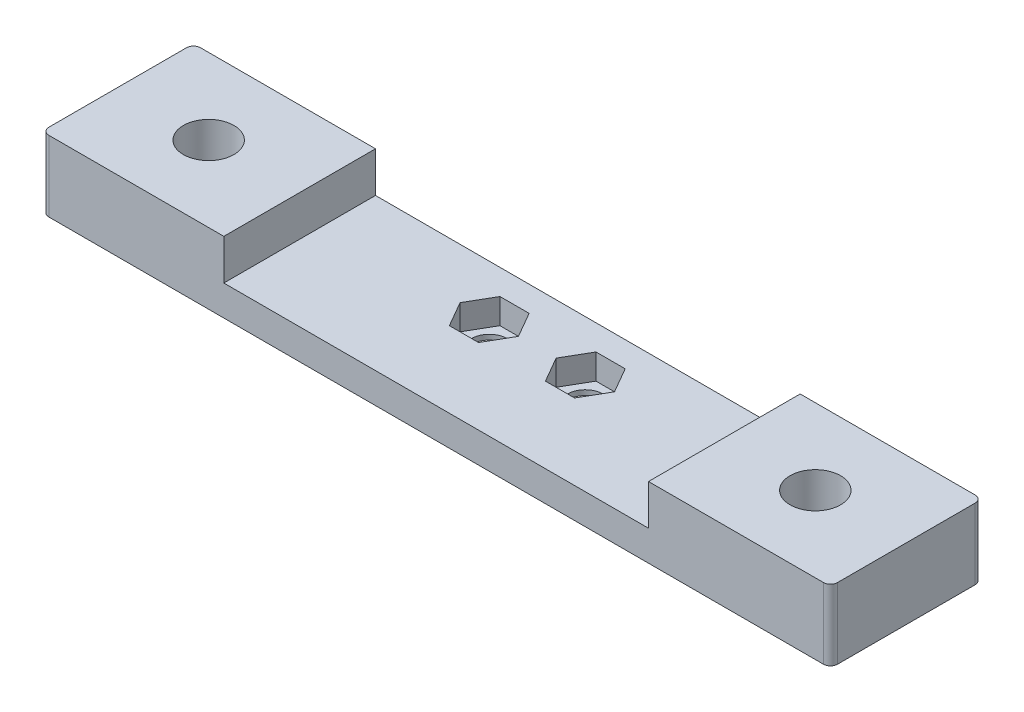
ISO-10303-21;
HEADER;
FILE_DESCRIPTION(('STEP AP214'),'2;1');
FILE_NAME('part.step','',(''),(''),'','','');
FILE_SCHEMA(('AUTOMOTIVE_DESIGN { 1 0 10303 214 1 1 1 1 }'));
ENDSEC;
DATA;
#1=APPLICATION_CONTEXT('core data for automotive mechanical design processes');
#2=APPLICATION_PROTOCOL_DEFINITION('international standard','automotive_design',2000,#1);
#3=PRODUCT_CONTEXT('',#1,'mechanical');
#4=PRODUCT('Part','Part','',(#3));
#5=PRODUCT_RELATED_PRODUCT_CATEGORY('part','',(#4));
#6=PRODUCT_DEFINITION_FORMATION('','',#4);
#7=PRODUCT_DEFINITION_CONTEXT('part definition',#1,'design');
#8=PRODUCT_DEFINITION('design','',#6,#7);
#9=PRODUCT_DEFINITION_SHAPE('','',#8);
#10=(LENGTH_UNIT() NAMED_UNIT(*) SI_UNIT(.MILLI.,.METRE.));
#11=(NAMED_UNIT(*) PLANE_ANGLE_UNIT() SI_UNIT($,.RADIAN.));
#12=(NAMED_UNIT(*) SI_UNIT($,.STERADIAN.) SOLID_ANGLE_UNIT());
#13=UNCERTAINTY_MEASURE_WITH_UNIT(LENGTH_MEASURE(1.E-05),#10,'distance_accuracy_value','');
#14=(GEOMETRIC_REPRESENTATION_CONTEXT(3) GLOBAL_UNCERTAINTY_ASSIGNED_CONTEXT((#13)) GLOBAL_UNIT_ASSIGNED_CONTEXT((#10,
#11,#12)) REPRESENTATION_CONTEXT('',''));
#15=CARTESIAN_POINT('',(0.,0.,0.));
#16=DIRECTION('',(0.,0.,1.));
#17=DIRECTION('',(1.,0.,0.));
#18=AXIS2_PLACEMENT_3D('',#15,#16,#17);
#19=CARTESIAN_POINT('',(0.,3.,0.));
#20=DIRECTION('',(0.,1.,0.));
#21=DIRECTION('',(0.,0.,1.));
#22=AXIS2_PLACEMENT_3D('',#19,#20,#21);
#23=PLANE('',#22);
#24=DIRECTION('',(-1.,0.,0.));
#25=VECTOR('',#24,1.);
#26=CARTESIAN_POINT('',(0.,3.,-12.5));
#27=LINE('',#26,#25);
#28=CARTESIAN_POINT('',(35.6933756729741,3.,-12.5));
#29=VERTEX_POINT('',#28);
#30=CARTESIAN_POINT('',(32.8066243270259,3.,-12.5));
#31=VERTEX_POINT('',#30);
#32=EDGE_CURVE('E381',#29,#31,#27,.T.);
#33=ORIENTED_EDGE('',*,*,#32,.F.);
#34=DIRECTION('',(-0.499999999999993,0.,-0.866025403784443));
#35=VECTOR('',#34,1.);
#36=CARTESIAN_POINT('',(32.1826905283835,3.,-18.5806850398083));
#37=LINE('',#36,#35);
#38=CARTESIAN_POINT('',(37.1367513459481,3.,-9.99999999999999));
#39=VERTEX_POINT('',#38);
#40=EDGE_CURVE('E385',#39,#29,#37,.T.);
#41=ORIENTED_EDGE('',*,*,#40,.F.);
#42=DIRECTION('',(0.499999999999999,0.,-0.866025403784439));
#43=VECTOR('',#42,1.);
#44=CARTESIAN_POINT('',(23.5224364905389,3.,13.5806850398085));
#45=LINE('',#44,#43);
#46=CARTESIAN_POINT('',(35.6933756729741,3.,-7.49999999999999));
#47=VERTEX_POINT('',#46);
#48=EDGE_CURVE('E389',#47,#39,#45,.T.);
#49=ORIENTED_EDGE('',*,*,#48,.F.);
#50=DIRECTION('',(1.,0.,0.));
#51=VECTOR('',#50,1.);
#52=CARTESIAN_POINT('',(0.,3.,-7.49999999999999));
#53=LINE('',#52,#51);
#54=CARTESIAN_POINT('',(32.8066243270259,3.,-7.49999999999999));
#55=VERTEX_POINT('',#54);
#56=EDGE_CURVE('E393',#55,#47,#53,.T.);
#57=ORIENTED_EDGE('',*,*,#56,.F.);
#58=DIRECTION('',(0.5,0.,0.866025403784439));
#59=VECTOR('',#58,1.);
#60=CARTESIAN_POINT('',(27.8525635094611,3.,-16.0806850398085));
#61=LINE('',#60,#59);
#62=CARTESIAN_POINT('',(31.3632486540519,3.,-10.));
#63=VERTEX_POINT('',#62);
#64=EDGE_CURVE('E397',#63,#55,#61,.T.);
#65=ORIENTED_EDGE('',*,*,#64,.F.);
#66=DIRECTION('',(-0.500000000000001,0.,0.866025403784438));
#67=VECTOR('',#66,1.);
#68=CARTESIAN_POINT('',(19.1923094716167,3.,11.0806850398085));
#69=LINE('',#68,#67);
#70=EDGE_CURVE('E401',#31,#63,#69,.T.);
#71=ORIENTED_EDGE('',*,*,#70,.F.);
#72=EDGE_LOOP('',(#33,#41,#49,#57,#65,#71));
#73=FACE_BOUND('',#72,.T.);
#74=DIRECTION('',(-0.500000000000005,0.,-0.866025403784436));
#75=VECTOR('',#74,1.);
#76=CARTESIAN_POINT('',(39.3076905283831,3.,-22.6943057077848));
#77=LINE('',#76,#75);
#78=CARTESIAN_POINT('',(46.6367513459481,3.,-10.));
#79=VERTEX_POINT('',#78);
#80=CARTESIAN_POINT('',(45.193375672974,3.,-12.5));
#81=VERTEX_POINT('',#80);
#82=EDGE_CURVE('E356',#79,#81,#77,.T.);
#83=ORIENTED_EDGE('',*,*,#82,.F.);
#84=DIRECTION('',(0.500000000000001,0.,-0.866025403784438));
#85=VECTOR('',#84,1.);
#86=CARTESIAN_POINT('',(30.6474364905389,3.,17.6943057077846));
#87=LINE('',#86,#85);
#88=CARTESIAN_POINT('',(45.193375672974,3.,-7.49999999999995));
#89=VERTEX_POINT('',#88);
#90=EDGE_CURVE('E360',#89,#79,#87,.T.);
#91=ORIENTED_EDGE('',*,*,#90,.F.);
#92=DIRECTION('',(1.,0.,0.));
#93=VECTOR('',#92,1.);
#94=CARTESIAN_POINT('',(0.,3.,-7.49999999999996));
#95=LINE('',#94,#93);
#96=CARTESIAN_POINT('',(42.306624327026,3.,-7.49999999999995));
#97=VERTEX_POINT('',#96);
#98=EDGE_CURVE('E365',#97,#89,#95,.T.);
#99=ORIENTED_EDGE('',*,*,#98,.F.);
#100=DIRECTION('',(0.499999999999999,0.,0.86602540378444));
#101=VECTOR('',#100,1.);
#102=CARTESIAN_POINT('',(34.9775635094612,3.,-20.1943057077845));
#103=LINE('',#102,#101);
#104=CARTESIAN_POINT('',(40.8632486540519,3.,-10.));
#105=VERTEX_POINT('',#104);
#106=EDGE_CURVE('E369',#105,#97,#103,.T.);
#107=ORIENTED_EDGE('',*,*,#106,.F.);
#108=DIRECTION('',(-0.499999999999999,0.,0.866025403784439));
#109=VECTOR('',#108,1.);
#110=CARTESIAN_POINT('',(26.3173094716167,3.,15.1943057077846));
#111=LINE('',#110,#109);
#112=CARTESIAN_POINT('',(42.3066243270259,3.,-12.5));
#113=VERTEX_POINT('',#112);
#114=EDGE_CURVE('E373',#113,#105,#111,.T.);
#115=ORIENTED_EDGE('',*,*,#114,.F.);
#116=DIRECTION('',(-1.,0.,0.));
#117=VECTOR('',#116,1.);
#118=CARTESIAN_POINT('',(0.,3.,-12.5));
#119=LINE('',#118,#117);
#120=EDGE_CURVE('E377',#81,#113,#119,.T.);
#121=ORIENTED_EDGE('',*,*,#120,.F.);
#122=EDGE_LOOP('',(#83,#91,#99,#107,#115,#121));
#123=FACE_BOUND('',#122,.T.);
#124=DIRECTION('',(1.,0.,0.));
#125=VECTOR('',#124,1.);
#126=CARTESIAN_POINT('',(0.,3.,-15.));
#127=LINE('',#126,#125);
#128=CARTESIAN_POINT('',(18.,3.,-15.));
#129=VERTEX_POINT('',#128);
#130=CARTESIAN_POINT('',(60.,3.,-15.));
#131=VERTEX_POINT('',#130);
#132=EDGE_CURVE('E57',#129,#131,#127,.T.);
#133=ORIENTED_EDGE('',*,*,#132,.F.);
#134=DIRECTION('',(0.,0.,1.));
#135=VECTOR('',#134,1.);
#136=CARTESIAN_POINT('',(18.,3.,0.));
#137=LINE('',#136,#135);
#138=CARTESIAN_POINT('',(18.,3.,0.));
#139=VERTEX_POINT('',#138);
#140=EDGE_CURVE('E248',#129,#139,#137,.T.);
#141=ORIENTED_EDGE('',*,*,#140,.T.);
#142=DIRECTION('',(1.,0.,0.));
#143=VECTOR('',#142,1.);
#144=CARTESIAN_POINT('',(0.,3.,0.));
#145=LINE('',#144,#143);
#146=CARTESIAN_POINT('',(60.,3.,0.));
#147=VERTEX_POINT('',#146);
#148=EDGE_CURVE('E208',#139,#147,#145,.T.);
#149=ORIENTED_EDGE('',*,*,#148,.T.);
#150=DIRECTION('',(0.,0.,1.));
#151=VECTOR('',#150,1.);
#152=CARTESIAN_POINT('',(60.,3.,0.));
#153=LINE('',#152,#151);
#154=EDGE_CURVE('E285',#131,#147,#153,.T.);
#155=ORIENTED_EDGE('',*,*,#154,.F.);
#156=EDGE_LOOP('',(#133,#141,#149,#155));
#157=FACE_BOUND('',#156,.T.);
#158=ADVANCED_FACE('F41',(#73,#123,#157),#23,.T.);
#159=CARTESIAN_POINT('',(0.,3.,0.));
#160=DIRECTION('',(0.,0.,-1.));
#161=DIRECTION('',(-1.,0.,0.));
#162=AXIS2_PLACEMENT_3D('',#159,#160,#161);
#163=PLANE('',#162);
#164=DIRECTION('',(1.,0.,0.));
#165=VECTOR('',#164,1.);
#166=CARTESIAN_POINT('',(0.,0.,0.));
#167=LINE('',#166,#165);
#168=CARTESIAN_POINT('',(0.7,0.,0.));
#169=VERTEX_POINT('',#168);
#170=CARTESIAN_POINT('',(77.3,0.,0.));
#171=VERTEX_POINT('',#170);
#172=EDGE_CURVE('E417',#169,#171,#167,.T.);
#173=ORIENTED_EDGE('',*,*,#172,.T.);
#174=DIRECTION('',(0.,-1.,0.));
#175=VECTOR('',#174,1.);
#176=CARTESIAN_POINT('',(77.3,3.,0.));
#177=LINE('',#176,#175);
#178=CARTESIAN_POINT('',(77.3,7.,0.));
#179=VERTEX_POINT('',#178);
#180=EDGE_CURVE('E505',#171,#179,#177,.F.);
#181=ORIENTED_EDGE('',*,*,#180,.T.);
#182=DIRECTION('',(-1.,0.,0.));
#183=VECTOR('',#182,1.);
#184=CARTESIAN_POINT('',(0.,7.,0.));
#185=LINE('',#184,#183);
#186=CARTESIAN_POINT('',(60.,7.,0.));
#187=VERTEX_POINT('',#186);
#188=EDGE_CURVE('E256',#179,#187,#185,.T.);
#189=ORIENTED_EDGE('',*,*,#188,.T.);
#190=DIRECTION('',(0.,-1.,0.));
#191=VECTOR('',#190,1.);
#192=CARTESIAN_POINT('',(60.,7.,0.));
#193=LINE('',#192,#191);
#194=EDGE_CURVE('E280',#187,#147,#193,.T.);
#195=ORIENTED_EDGE('',*,*,#194,.T.);
#196=ORIENTED_EDGE('',*,*,#148,.F.);
#197=DIRECTION('',(0.,-1.,0.));
#198=VECTOR('',#197,1.);
#199=CARTESIAN_POINT('',(18.,7.,0.));
#200=LINE('',#199,#198);
#201=CARTESIAN_POINT('',(18.,7.,0.));
#202=VERTEX_POINT('',#201);
#203=EDGE_CURVE('E201',#202,#139,#200,.T.);
#204=ORIENTED_EDGE('',*,*,#203,.F.);
#205=DIRECTION('',(-1.,0.,0.));
#206=VECTOR('',#205,1.);
#207=CARTESIAN_POINT('',(0.,7.,0.));
#208=LINE('',#207,#206);
#209=CARTESIAN_POINT('',(0.7,7.,0.));
#210=VERTEX_POINT('',#209);
#211=EDGE_CURVE('E206',#202,#210,#208,.T.);
#212=ORIENTED_EDGE('',*,*,#211,.T.);
#213=DIRECTION('',(0.,-1.,0.));
#214=VECTOR('',#213,1.);
#215=CARTESIAN_POINT('',(0.7,0.,0.));
#216=LINE('',#215,#214);
#217=EDGE_CURVE('E502',#210,#169,#216,.T.);
#218=ORIENTED_EDGE('',*,*,#217,.T.);
#219=EDGE_LOOP('',(#173,#181,#189,#195,#196,#204,#212,#218));
#220=FACE_BOUND('',#219,.T.);
#221=ADVANCED_FACE('F203',(#220),#163,.F.);
#222=CARTESIAN_POINT('',(78.,3.,0.));
#223=DIRECTION('',(-1.,0.,0.));
#224=DIRECTION('',(0.,0.,1.));
#225=AXIS2_PLACEMENT_3D('',#222,#223,#224);
#226=PLANE('',#225);
#227=DIRECTION('',(0.,0.,-1.));
#228=VECTOR('',#227,1.);
#229=CARTESIAN_POINT('',(78.,0.,0.));
#230=LINE('',#229,#228);
#231=CARTESIAN_POINT('',(78.,0.,-0.7));
#232=VERTEX_POINT('',#231);
#233=CARTESIAN_POINT('',(78.,0.,-14.3));
#234=VERTEX_POINT('',#233);
#235=EDGE_CURVE('E420',#232,#234,#230,.T.);
#236=ORIENTED_EDGE('',*,*,#235,.T.);
#237=DIRECTION('',(0.,-1.,0.));
#238=VECTOR('',#237,1.);
#239=CARTESIAN_POINT('',(78.,3.,-14.3));
#240=LINE('',#239,#238);
#241=CARTESIAN_POINT('',(78.,7.,-14.3));
#242=VERTEX_POINT('',#241);
#243=EDGE_CURVE('E499',#234,#242,#240,.F.);
#244=ORIENTED_EDGE('',*,*,#243,.T.);
#245=DIRECTION('',(0.,0.,1.));
#246=VECTOR('',#245,1.);
#247=CARTESIAN_POINT('',(78.,7.,0.));
#248=LINE('',#247,#246);
#249=CARTESIAN_POINT('',(78.,7.,-0.7));
#250=VERTEX_POINT('',#249);
#251=EDGE_CURVE('E272',#242,#250,#248,.T.);
#252=ORIENTED_EDGE('',*,*,#251,.T.);
#253=DIRECTION('',(0.,-1.,0.));
#254=VECTOR('',#253,1.);
#255=CARTESIAN_POINT('',(78.,3.,-0.7));
#256=LINE('',#255,#254);
#257=EDGE_CURVE('E495',#250,#232,#256,.T.);
#258=ORIENTED_EDGE('',*,*,#257,.T.);
#259=EDGE_LOOP('',(#236,#244,#252,#258));
#260=FACE_BOUND('',#259,.T.);
#261=ADVANCED_FACE('F552',(#260),#226,.F.);
#262=CARTESIAN_POINT('',(0.,3.,-15.));
#263=DIRECTION('',(0.,0.,-1.));
#264=DIRECTION('',(-1.,0.,0.));
#265=AXIS2_PLACEMENT_3D('',#262,#263,#264);
#266=PLANE('',#265);
#267=DIRECTION('',(0.,-1.,0.));
#268=VECTOR('',#267,1.);
#269=CARTESIAN_POINT('',(18.,7.,-15.));
#270=LINE('',#269,#268);
#271=CARTESIAN_POINT('',(18.,7.,-15.));
#272=VERTEX_POINT('',#271);
#273=EDGE_CURVE('E211',#272,#129,#270,.T.);
#274=ORIENTED_EDGE('',*,*,#273,.T.);
#275=ORIENTED_EDGE('',*,*,#132,.T.);
#276=DIRECTION('',(0.,-1.,0.));
#277=VECTOR('',#276,1.);
#278=CARTESIAN_POINT('',(60.,7.,-15.));
#279=LINE('',#278,#277);
#280=CARTESIAN_POINT('',(60.,7.,-15.));
#281=VERTEX_POINT('',#280);
#282=EDGE_CURVE('E281',#281,#131,#279,.T.);
#283=ORIENTED_EDGE('',*,*,#282,.F.);
#284=DIRECTION('',(1.,0.,0.));
#285=VECTOR('',#284,1.);
#286=CARTESIAN_POINT('',(0.,7.,-15.));
#287=LINE('',#286,#285);
#288=CARTESIAN_POINT('',(77.3,7.,-15.));
#289=VERTEX_POINT('',#288);
#290=EDGE_CURVE('E264',#281,#289,#287,.T.);
#291=ORIENTED_EDGE('',*,*,#290,.T.);
#292=DIRECTION('',(0.,-1.,0.));
#293=VECTOR('',#292,1.);
#294=CARTESIAN_POINT('',(77.3,0.,-15.));
#295=LINE('',#294,#293);
#296=CARTESIAN_POINT('',(77.3,0.,-15.));
#297=VERTEX_POINT('',#296);
#298=EDGE_CURVE('E478',#289,#297,#295,.T.);
#299=ORIENTED_EDGE('',*,*,#298,.T.);
#300=DIRECTION('',(1.,0.,0.));
#301=VECTOR('',#300,1.);
#302=CARTESIAN_POINT('',(0.,0.,-15.));
#303=LINE('',#302,#301);
#304=CARTESIAN_POINT('',(0.7,0.,-15.));
#305=VERTEX_POINT('',#304);
#306=EDGE_CURVE('E424',#305,#297,#303,.T.);
#307=ORIENTED_EDGE('',*,*,#306,.F.);
#308=DIRECTION('',(0.,-1.,0.));
#309=VECTOR('',#308,1.);
#310=CARTESIAN_POINT('',(0.7,3.,-15.));
#311=LINE('',#310,#309);
#312=CARTESIAN_POINT('',(0.7,7.,-15.));
#313=VERTEX_POINT('',#312);
#314=EDGE_CURVE('E454',#305,#313,#311,.F.);
#315=ORIENTED_EDGE('',*,*,#314,.T.);
#316=DIRECTION('',(1.,0.,0.));
#317=VECTOR('',#316,1.);
#318=CARTESIAN_POINT('',(0.,7.,-15.));
#319=LINE('',#318,#317);
#320=EDGE_CURVE('E241',#313,#272,#319,.T.);
#321=ORIENTED_EDGE('',*,*,#320,.T.);
#322=EDGE_LOOP('',(#274,#275,#283,#291,#299,#307,#315,#321));
#323=FACE_BOUND('',#322,.T.);
#324=ADVANCED_FACE('F536',(#323),#266,.T.);
#325=CARTESIAN_POINT('',(0.,3.,-12.5));
#326=DIRECTION('',(0.,0.,1.));
#327=DIRECTION('',(1.,0.,0.));
#328=AXIS2_PLACEMENT_3D('',#325,#326,#327);
#329=PLANE('',#328);
#330=DIRECTION('',(-1.,0.,0.));
#331=VECTOR('',#330,1.);
#332=CARTESIAN_POINT('',(0.,0.5,-12.5));
#333=LINE('',#332,#331);
#334=CARTESIAN_POINT('',(35.6933756729741,0.5,-12.5));
#335=VERTEX_POINT('',#334);
#336=CARTESIAN_POINT('',(32.8066243270259,0.5,-12.5));
#337=VERTEX_POINT('',#336);
#338=EDGE_CURVE('E332',#335,#337,#333,.T.);
#339=ORIENTED_EDGE('',*,*,#338,.F.);
#340=DIRECTION('',(0.,-1.,0.));
#341=VECTOR('',#340,1.);
#342=CARTESIAN_POINT('',(35.6933756729741,3.,-12.5));
#343=LINE('',#342,#341);
#344=EDGE_CURVE('E450',#29,#335,#343,.T.);
#345=ORIENTED_EDGE('',*,*,#344,.F.);
#346=ORIENTED_EDGE('',*,*,#32,.T.);
#347=DIRECTION('',(0.,-1.,0.));
#348=VECTOR('',#347,1.);
#349=CARTESIAN_POINT('',(32.8066243270259,3.,-12.5));
#350=LINE('',#349,#348);
#351=EDGE_CURVE('E430',#31,#337,#350,.T.);
#352=ORIENTED_EDGE('',*,*,#351,.T.);
#353=EDGE_LOOP('',(#339,#345,#346,#352));
#354=FACE_BOUND('',#353,.T.);
#355=ADVANCED_FACE('F568',(#354),#329,.T.);
#356=CARTESIAN_POINT('',(32.1826905283835,3.,-18.5806850398083));
#357=DIRECTION('',(-0.866025403784443,0.,0.499999999999993));
#358=DIRECTION('',(0.499999999999993,0.,0.866025403784443));
#359=AXIS2_PLACEMENT_3D('',#356,#357,#358);
#360=PLANE('',#359);
#361=DIRECTION('',(-0.499999999999993,0.,-0.866025403784443));
#362=VECTOR('',#361,1.);
#363=CARTESIAN_POINT('',(32.1826905283835,0.5,-18.5806850398083));
#364=LINE('',#363,#362);
#365=CARTESIAN_POINT('',(37.1367513459481,0.5,-9.99999999999999));
#366=VERTEX_POINT('',#365);
#367=EDGE_CURVE('E328',#366,#335,#364,.T.);
#368=ORIENTED_EDGE('',*,*,#367,.F.);
#369=DIRECTION('',(0.,-1.,0.));
#370=VECTOR('',#369,1.);
#371=CARTESIAN_POINT('',(37.1367513459481,3.,-9.99999999999999));
#372=LINE('',#371,#370);
#373=EDGE_CURVE('E446',#39,#366,#372,.T.);
#374=ORIENTED_EDGE('',*,*,#373,.F.);
#375=ORIENTED_EDGE('',*,*,#40,.T.);
#376=ORIENTED_EDGE('',*,*,#344,.T.);
#377=EDGE_LOOP('',(#368,#374,#375,#376));
#378=FACE_BOUND('',#377,.T.);
#379=ADVANCED_FACE('F590',(#378),#360,.T.);
#380=CARTESIAN_POINT('',(23.5224364905389,3.,13.5806850398085));
#381=DIRECTION('',(-0.866025403784439,0.,-0.499999999999999));
#382=DIRECTION('',(-0.499999999999999,0.,0.866025403784439));
#383=AXIS2_PLACEMENT_3D('',#380,#381,#382);
#384=PLANE('',#383);
#385=DIRECTION('',(0.499999999999999,0.,-0.866025403784439));
#386=VECTOR('',#385,1.);
#387=CARTESIAN_POINT('',(23.5224364905389,0.5,13.5806850398085));
#388=LINE('',#387,#386);
#389=CARTESIAN_POINT('',(35.6933756729741,0.5,-7.49999999999999));
#390=VERTEX_POINT('',#389);
#391=EDGE_CURVE('E348',#390,#366,#388,.T.);
#392=ORIENTED_EDGE('',*,*,#391,.F.);
#393=DIRECTION('',(0.,-1.,0.));
#394=VECTOR('',#393,1.);
#395=CARTESIAN_POINT('',(35.6933756729741,3.,-7.49999999999999));
#396=LINE('',#395,#394);
#397=EDGE_CURVE('E442',#47,#390,#396,.T.);
#398=ORIENTED_EDGE('',*,*,#397,.F.);
#399=ORIENTED_EDGE('',*,*,#48,.T.);
#400=ORIENTED_EDGE('',*,*,#373,.T.);
#401=EDGE_LOOP('',(#392,#398,#399,#400));
#402=FACE_BOUND('',#401,.T.);
#403=ADVANCED_FACE('F586',(#402),#384,.T.);
#404=CARTESIAN_POINT('',(0.,3.,-7.49999999999999));
#405=DIRECTION('',(0.,0.,-1.));
#406=DIRECTION('',(-1.,0.,0.));
#407=AXIS2_PLACEMENT_3D('',#404,#405,#406);
#408=PLANE('',#407);
#409=DIRECTION('',(1.,0.,0.));
#410=VECTOR('',#409,1.);
#411=CARTESIAN_POINT('',(0.,0.5,-7.49999999999999));
#412=LINE('',#411,#410);
#413=CARTESIAN_POINT('',(32.8066243270259,0.5,-7.49999999999999));
#414=VERTEX_POINT('',#413);
#415=EDGE_CURVE('E344',#414,#390,#412,.T.);
#416=ORIENTED_EDGE('',*,*,#415,.F.);
#417=DIRECTION('',(0.,-1.,0.));
#418=VECTOR('',#417,1.);
#419=CARTESIAN_POINT('',(32.8066243270259,3.,-7.49999999999999));
#420=LINE('',#419,#418);
#421=EDGE_CURVE('E438',#55,#414,#420,.T.);
#422=ORIENTED_EDGE('',*,*,#421,.F.);
#423=ORIENTED_EDGE('',*,*,#56,.T.);
#424=ORIENTED_EDGE('',*,*,#397,.T.);
#425=EDGE_LOOP('',(#416,#422,#423,#424));
#426=FACE_BOUND('',#425,.T.);
#427=ADVANCED_FACE('F582',(#426),#408,.T.);
#428=CARTESIAN_POINT('',(27.8525635094611,3.,-16.0806850398085));
#429=DIRECTION('',(0.866025403784438,0.,-0.5));
#430=DIRECTION('',(-0.5,0.,-0.866025403784439));
#431=AXIS2_PLACEMENT_3D('',#428,#429,#430);
#432=PLANE('',#431);
#433=DIRECTION('',(0.5,0.,0.866025403784439));
#434=VECTOR('',#433,1.);
#435=CARTESIAN_POINT('',(27.8525635094611,0.5,-16.0806850398085));
#436=LINE('',#435,#434);
#437=CARTESIAN_POINT('',(31.3632486540519,0.5,-10.));
#438=VERTEX_POINT('',#437);
#439=EDGE_CURVE('E340',#438,#414,#436,.T.);
#440=ORIENTED_EDGE('',*,*,#439,.F.);
#441=DIRECTION('',(0.,-1.,0.));
#442=VECTOR('',#441,1.);
#443=CARTESIAN_POINT('',(31.3632486540519,3.,-10.));
#444=LINE('',#443,#442);
#445=EDGE_CURVE('E434',#63,#438,#444,.T.);
#446=ORIENTED_EDGE('',*,*,#445,.F.);
#447=ORIENTED_EDGE('',*,*,#64,.T.);
#448=ORIENTED_EDGE('',*,*,#421,.T.);
#449=EDGE_LOOP('',(#440,#446,#447,#448));
#450=FACE_BOUND('',#449,.T.);
#451=ADVANCED_FACE('F578',(#450),#432,.T.);
#452=CARTESIAN_POINT('',(39.3076905283831,3.,-22.6943057077848));
#453=DIRECTION('',(-0.866025403784436,0.,0.500000000000004));
#454=DIRECTION('',(0.500000000000004,0.,0.866025403784436));
#455=AXIS2_PLACEMENT_3D('',#452,#453,#454);
#456=PLANE('',#455);
#457=DIRECTION('',(-0.500000000000005,0.,-0.866025403784436));
#458=VECTOR('',#457,1.);
#459=CARTESIAN_POINT('',(39.3076905283831,0.5,-22.6943057077848));
#460=LINE('',#459,#458);
#461=CARTESIAN_POINT('',(46.6367513459481,0.5,-10.));
#462=VERTEX_POINT('',#461);
#463=CARTESIAN_POINT('',(45.193375672974,0.5,-12.5));
#464=VERTEX_POINT('',#463);
#465=EDGE_CURVE('E300',#462,#464,#460,.T.);
#466=ORIENTED_EDGE('',*,*,#465,.F.);
#467=DIRECTION('',(0.,-1.,0.));
#468=VECTOR('',#467,1.);
#469=CARTESIAN_POINT('',(46.6367513459481,3.,-10.));
#470=LINE('',#469,#468);
#471=EDGE_CURVE('E435',#79,#462,#470,.T.);
#472=ORIENTED_EDGE('',*,*,#471,.F.);
#473=ORIENTED_EDGE('',*,*,#82,.T.);
#474=DIRECTION('',(0.,-1.,0.));
#475=VECTOR('',#474,1.);
#476=CARTESIAN_POINT('',(45.193375672974,3.,-12.5));
#477=LINE('',#476,#475);
#478=EDGE_CURVE('E409',#81,#464,#477,.T.);
#479=ORIENTED_EDGE('',*,*,#478,.T.);
#480=EDGE_LOOP('',(#466,#472,#473,#479));
#481=FACE_BOUND('',#480,.T.);
#482=ADVANCED_FACE('F581',(#481),#456,.T.);
#483=CARTESIAN_POINT('',(30.6474364905389,3.,17.6943057077846));
#484=DIRECTION('',(-0.866025403784438,0.,-0.500000000000001));
#485=DIRECTION('',(-0.500000000000001,0.,0.866025403784438));
#486=AXIS2_PLACEMENT_3D('',#483,#484,#485);
#487=PLANE('',#486);
#488=DIRECTION('',(0.500000000000001,0.,-0.866025403784438));
#489=VECTOR('',#488,1.);
#490=CARTESIAN_POINT('',(30.6474364905389,0.5,17.6943057077846));
#491=LINE('',#490,#489);
#492=CARTESIAN_POINT('',(45.193375672974,0.5,-7.49999999999995));
#493=VERTEX_POINT('',#492);
#494=EDGE_CURVE('E296',#493,#462,#491,.T.);
#495=ORIENTED_EDGE('',*,*,#494,.F.);
#496=DIRECTION('',(0.,-1.,0.));
#497=VECTOR('',#496,1.);
#498=CARTESIAN_POINT('',(45.193375672974,3.,-7.49999999999995));
#499=LINE('',#498,#497);
#500=EDGE_CURVE('E469',#89,#493,#499,.T.);
#501=ORIENTED_EDGE('',*,*,#500,.F.);
#502=ORIENTED_EDGE('',*,*,#90,.T.);
#503=ORIENTED_EDGE('',*,*,#471,.T.);
#504=EDGE_LOOP('',(#495,#501,#502,#503));
#505=FACE_BOUND('',#504,.T.);
#506=ADVANCED_FACE('F612',(#505),#487,.T.);
#507=CARTESIAN_POINT('',(0.,3.,-7.49999999999996));
#508=DIRECTION('',(0.,0.,-1.));
#509=DIRECTION('',(-1.,0.,0.));
#510=AXIS2_PLACEMENT_3D('',#507,#508,#509);
#511=PLANE('',#510);
#512=DIRECTION('',(1.,0.,0.));
#513=VECTOR('',#512,1.);
#514=CARTESIAN_POINT('',(0.,0.5,-7.49999999999996));
#515=LINE('',#514,#513);
#516=CARTESIAN_POINT('',(42.306624327026,0.5,-7.49999999999995));
#517=VERTEX_POINT('',#516);
#518=EDGE_CURVE('E316',#517,#493,#515,.T.);
#519=ORIENTED_EDGE('',*,*,#518,.F.);
#520=DIRECTION('',(0.,-1.,0.));
#521=VECTOR('',#520,1.);
#522=CARTESIAN_POINT('',(42.306624327026,3.,-7.49999999999995));
#523=LINE('',#522,#521);
#524=EDGE_CURVE('E465',#97,#517,#523,.T.);
#525=ORIENTED_EDGE('',*,*,#524,.F.);
#526=ORIENTED_EDGE('',*,*,#98,.T.);
#527=ORIENTED_EDGE('',*,*,#500,.T.);
#528=EDGE_LOOP('',(#519,#525,#526,#527));
#529=FACE_BOUND('',#528,.T.);
#530=ADVANCED_FACE('F608',(#529),#511,.T.);
#531=CARTESIAN_POINT('',(34.9775635094612,3.,-20.1943057077845));
#532=DIRECTION('',(0.866025403784439,0.,-0.499999999999998));
#533=DIRECTION('',(-0.499999999999999,0.,-0.86602540378444));
#534=AXIS2_PLACEMENT_3D('',#531,#532,#533);
#535=PLANE('',#534);
#536=DIRECTION('',(0.499999999999999,0.,0.86602540378444));
#537=VECTOR('',#536,1.);
#538=CARTESIAN_POINT('',(34.9775635094612,0.5,-20.1943057077845));
#539=LINE('',#538,#537);
#540=CARTESIAN_POINT('',(40.8632486540519,0.5,-10.));
#541=VERTEX_POINT('',#540);
#542=EDGE_CURVE('E312',#541,#517,#539,.T.);
#543=ORIENTED_EDGE('',*,*,#542,.F.);
#544=DIRECTION('',(0.,-1.,0.));
#545=VECTOR('',#544,1.);
#546=CARTESIAN_POINT('',(40.8632486540519,3.,-10.));
#547=LINE('',#546,#545);
#548=EDGE_CURVE('E461',#105,#541,#547,.T.);
#549=ORIENTED_EDGE('',*,*,#548,.F.);
#550=ORIENTED_EDGE('',*,*,#106,.T.);
#551=ORIENTED_EDGE('',*,*,#524,.T.);
#552=EDGE_LOOP('',(#543,#549,#550,#551));
#553=FACE_BOUND('',#552,.T.);
#554=ADVANCED_FACE('F604',(#553),#535,.T.);
#555=CARTESIAN_POINT('',(26.3173094716167,3.,15.1943057077846));
#556=DIRECTION('',(0.866025403784439,0.,0.499999999999999));
#557=DIRECTION('',(0.499999999999999,0.,-0.866025403784439));
#558=AXIS2_PLACEMENT_3D('',#555,#556,#557);
#559=PLANE('',#558);
#560=DIRECTION('',(-0.499999999999999,0.,0.866025403784439));
#561=VECTOR('',#560,1.);
#562=CARTESIAN_POINT('',(26.3173094716167,0.5,15.1943057077846));
#563=LINE('',#562,#561);
#564=CARTESIAN_POINT('',(42.3066243270259,0.5,-12.5));
#565=VERTEX_POINT('',#564);
#566=EDGE_CURVE('E308',#565,#541,#563,.T.);
#567=ORIENTED_EDGE('',*,*,#566,.F.);
#568=DIRECTION('',(0.,-1.,0.));
#569=VECTOR('',#568,1.);
#570=CARTESIAN_POINT('',(42.3066243270259,3.,-12.5));
#571=LINE('',#570,#569);
#572=EDGE_CURVE('E458',#113,#565,#571,.T.);
#573=ORIENTED_EDGE('',*,*,#572,.F.);
#574=ORIENTED_EDGE('',*,*,#114,.T.);
#575=ORIENTED_EDGE('',*,*,#548,.T.);
#576=EDGE_LOOP('',(#567,#573,#574,#575));
#577=FACE_BOUND('',#576,.T.);
#578=ADVANCED_FACE('F576',(#577),#559,.T.);
#579=CARTESIAN_POINT('',(19.1923094716167,3.,11.0806850398085));
#580=DIRECTION('',(0.866025403784438,0.,0.500000000000001));
#581=DIRECTION('',(0.500000000000001,0.,-0.866025403784438));
#582=AXIS2_PLACEMENT_3D('',#579,#580,#581);
#583=PLANE('',#582);
#584=DIRECTION('',(-0.500000000000001,0.,0.866025403784438));
#585=VECTOR('',#584,1.);
#586=CARTESIAN_POINT('',(19.1923094716167,0.5,11.0806850398085));
#587=LINE('',#586,#585);
#588=EDGE_CURVE('E336',#337,#438,#587,.T.);
#589=ORIENTED_EDGE('',*,*,#588,.F.);
#590=ORIENTED_EDGE('',*,*,#351,.F.);
#591=ORIENTED_EDGE('',*,*,#70,.T.);
#592=ORIENTED_EDGE('',*,*,#445,.T.);
#593=EDGE_LOOP('',(#589,#590,#591,#592));
#594=FACE_BOUND('',#593,.T.);
#595=ADVANCED_FACE('F572',(#594),#583,.T.);
#596=CARTESIAN_POINT('',(0.,3.,-12.5));
#597=DIRECTION('',(0.,0.,1.));
#598=DIRECTION('',(1.,0.,0.));
#599=AXIS2_PLACEMENT_3D('',#596,#597,#598);
#600=PLANE('',#599);
#601=DIRECTION('',(-1.,0.,0.));
#602=VECTOR('',#601,1.);
#603=CARTESIAN_POINT('',(0.,0.5,-12.5));
#604=LINE('',#603,#602);
#605=EDGE_CURVE('E304',#464,#565,#604,.T.);
#606=ORIENTED_EDGE('',*,*,#605,.F.);
#607=ORIENTED_EDGE('',*,*,#478,.F.);
#608=ORIENTED_EDGE('',*,*,#120,.T.);
#609=ORIENTED_EDGE('',*,*,#572,.T.);
#610=EDGE_LOOP('',(#606,#607,#608,#609));
#611=FACE_BOUND('',#610,.T.);
#612=ADVANCED_FACE('F575',(#611),#600,.T.);
#613=CARTESIAN_POINT('',(9.,3.,-7.5));
#614=DIRECTION('',(0.,-1.,0.));
#615=DIRECTION('',(0.,0.,-1.));
#616=AXIS2_PLACEMENT_3D('',#613,#614,#615);
#617=CYLINDRICAL_SURFACE('',#616,2.5);
#618=CARTESIAN_POINT('',(9.,0.,-7.5));
#619=DIRECTION('',(0.,1.,0.));
#620=DIRECTION('',(0.,0.,1.));
#621=AXIS2_PLACEMENT_3D('',#618,#619,#620);
#622=CIRCLE('',#621,2.5);
#623=CARTESIAN_POINT('',(9.,0.,-5.));
#624=VERTEX_POINT('',#623);
#625=EDGE_CURVE('E413',#624,#624,#622,.T.);
#626=ORIENTED_EDGE('',*,*,#625,.F.);
#627=EDGE_LOOP('',(#626));
#628=FACE_BOUND('',#627,.T.);
#629=CARTESIAN_POINT('',(9.,7.,-7.5));
#630=DIRECTION('',(0.,-1.,0.));
#631=DIRECTION('',(0.,0.,-1.));
#632=AXIS2_PLACEMENT_3D('',#629,#630,#631);
#633=CIRCLE('',#632,2.5);
#634=CARTESIAN_POINT('',(9.,7.,-10.));
#635=VERTEX_POINT('',#634);
#636=EDGE_CURVE('E212',#635,#635,#633,.F.);
#637=ORIENTED_EDGE('',*,*,#636,.T.);
#638=EDGE_LOOP('',(#637));
#639=FACE_BOUND('',#638,.T.);
#640=ADVANCED_FACE('F600',(#628,#639),#617,.F.);
#641=CARTESIAN_POINT('',(69.,3.,-7.5));
#642=DIRECTION('',(0.,-1.,0.));
#643=DIRECTION('',(0.,0.,-1.));
#644=AXIS2_PLACEMENT_3D('',#641,#642,#643);
#645=CYLINDRICAL_SURFACE('',#644,2.50000000000001);
#646=CARTESIAN_POINT('',(69.,0.,-7.5));
#647=DIRECTION('',(0.,1.,0.));
#648=DIRECTION('',(0.,0.,1.));
#649=AXIS2_PLACEMENT_3D('',#646,#647,#648);
#650=CIRCLE('',#649,2.50000000000001);
#651=CARTESIAN_POINT('',(69.,0.,-4.99999999999999));
#652=VERTEX_POINT('',#651);
#653=EDGE_CURVE('E352',#652,#652,#650,.T.);
#654=ORIENTED_EDGE('',*,*,#653,.F.);
#655=EDGE_LOOP('',(#654));
#656=FACE_BOUND('',#655,.T.);
#657=CARTESIAN_POINT('',(69.,7.,-7.5));
#658=DIRECTION('',(0.,-1.,0.));
#659=DIRECTION('',(0.,0.,-1.));
#660=AXIS2_PLACEMENT_3D('',#657,#658,#659);
#661=CIRCLE('',#660,2.50000000000001);
#662=CARTESIAN_POINT('',(69.,7.,-10.));
#663=VERTEX_POINT('',#662);
#664=EDGE_CURVE('E252',#663,#663,#661,.F.);
#665=ORIENTED_EDGE('',*,*,#664,.T.);
#666=EDGE_LOOP('',(#665));
#667=FACE_BOUND('',#666,.T.);
#668=ADVANCED_FACE('F565',(#656,#667),#645,.F.);
#669=CARTESIAN_POINT('',(0.,3.,0.));
#670=DIRECTION('',(-1.,0.,0.));
#671=DIRECTION('',(0.,0.,1.));
#672=AXIS2_PLACEMENT_3D('',#669,#670,#671);
#673=PLANE('',#672);
#674=DIRECTION('',(0.,0.,-1.));
#675=VECTOR('',#674,1.);
#676=CARTESIAN_POINT('',(0.,0.,0.));
#677=LINE('',#676,#675);
#678=CARTESIAN_POINT('',(0.,0.,-0.7));
#679=VERTEX_POINT('',#678);
#680=CARTESIAN_POINT('',(0.,0.,-14.3));
#681=VERTEX_POINT('',#680);
#682=EDGE_CURVE('E361',#679,#681,#677,.T.);
#683=ORIENTED_EDGE('',*,*,#682,.F.);
#684=DIRECTION('',(0.,-1.,0.));
#685=VECTOR('',#684,1.);
#686=CARTESIAN_POINT('',(0.,3.,-0.7));
#687=LINE('',#686,#685);
#688=CARTESIAN_POINT('',(0.,7.,-0.7));
#689=VERTEX_POINT('',#688);
#690=EDGE_CURVE('E11',#679,#689,#687,.F.);
#691=ORIENTED_EDGE('',*,*,#690,.T.);
#692=DIRECTION('',(0.,0.,-1.));
#693=VECTOR('',#692,1.);
#694=CARTESIAN_POINT('',(0.,7.,0.));
#695=LINE('',#694,#693);
#696=CARTESIAN_POINT('',(0.,7.,-14.3));
#697=VERTEX_POINT('',#696);
#698=EDGE_CURVE('E231',#689,#697,#695,.T.);
#699=ORIENTED_EDGE('',*,*,#698,.T.);
#700=DIRECTION('',(0.,-1.,0.));
#701=VECTOR('',#700,1.);
#702=CARTESIAN_POINT('',(0.,3.,-14.3));
#703=LINE('',#702,#701);
#704=EDGE_CURVE('E50',#697,#681,#703,.T.);
#705=ORIENTED_EDGE('',*,*,#704,.T.);
#706=EDGE_LOOP('',(#683,#691,#699,#705));
#707=FACE_BOUND('',#706,.T.);
#708=ADVANCED_FACE('F511',(#707),#673,.T.);
#709=CARTESIAN_POINT('',(0.,0.,0.));
#710=DIRECTION('',(0.,1.,0.));
#711=DIRECTION('',(0.,0.,1.));
#712=AXIS2_PLACEMENT_3D('',#709,#710,#711);
#713=PLANE('',#712);
#714=ORIENTED_EDGE('',*,*,#625,.T.);
#715=EDGE_LOOP('',(#714));
#716=FACE_BOUND('',#715,.T.);
#717=ORIENTED_EDGE('',*,*,#306,.T.);
#718=CARTESIAN_POINT('',(77.3,0.,-14.3));
#719=DIRECTION('',(0.,1.,0.));
#720=DIRECTION('',(0.,0.,1.));
#721=AXIS2_PLACEMENT_3D('',#718,#719,#720);
#722=CIRCLE('',#721,0.7);
#723=EDGE_CURVE('E492',#297,#234,#722,.F.);
#724=ORIENTED_EDGE('',*,*,#723,.T.);
#725=ORIENTED_EDGE('',*,*,#235,.F.);
#726=CARTESIAN_POINT('',(77.3,0.,-0.7));
#727=DIRECTION('',(0.,1.,0.));
#728=DIRECTION('',(0.,0.,1.));
#729=AXIS2_PLACEMENT_3D('',#726,#727,#728);
#730=CIRCLE('',#729,0.7);
#731=EDGE_CURVE('E488',#232,#171,#730,.F.);
#732=ORIENTED_EDGE('',*,*,#731,.T.);
#733=ORIENTED_EDGE('',*,*,#172,.F.);
#734=CARTESIAN_POINT('',(0.7,0.,-0.7));
#735=DIRECTION('',(0.,1.,0.));
#736=DIRECTION('',(0.,0.,1.));
#737=AXIS2_PLACEMENT_3D('',#734,#735,#736);
#738=CIRCLE('',#737,0.7);
#739=EDGE_CURVE('E485',#169,#679,#738,.F.);
#740=ORIENTED_EDGE('',*,*,#739,.T.);
#741=ORIENTED_EDGE('',*,*,#682,.T.);
#742=CARTESIAN_POINT('',(0.7,0.,-14.3));
#743=DIRECTION('',(0.,1.,0.));
#744=DIRECTION('',(0.,0.,1.));
#745=AXIS2_PLACEMENT_3D('',#742,#743,#744);
#746=CIRCLE('',#745,0.7);
#747=EDGE_CURVE('E482',#681,#305,#746,.F.);
#748=ORIENTED_EDGE('',*,*,#747,.T.);
#749=EDGE_LOOP('',(#717,#724,#725,#732,#733,#740,#741,#748));
#750=FACE_BOUND('',#749,.T.);
#751=ORIENTED_EDGE('',*,*,#653,.T.);
#752=EDGE_LOOP('',(#751));
#753=FACE_BOUND('',#752,.T.);
#754=CARTESIAN_POINT('',(43.75,0.,-10.));
#755=DIRECTION('',(0.,1.,0.));
#756=DIRECTION('',(0.,0.,1.));
#757=AXIS2_PLACEMENT_3D('',#754,#755,#756);
#758=CIRCLE('',#757,1.75);
#759=CARTESIAN_POINT('',(43.75,0.,-8.24999999999999));
#760=VERTEX_POINT('',#759);
#761=EDGE_CURVE('E291',#760,#760,#758,.T.);
#762=ORIENTED_EDGE('',*,*,#761,.T.);
#763=EDGE_LOOP('',(#762));
#764=FACE_BOUND('',#763,.T.);
#765=CARTESIAN_POINT('',(34.25,0.,-10.));
#766=DIRECTION('',(0.,1.,0.));
#767=DIRECTION('',(0.,0.,1.));
#768=AXIS2_PLACEMENT_3D('',#765,#766,#767);
#769=CIRCLE('',#768,1.75);
#770=CARTESIAN_POINT('',(34.25,0.,-8.24999999999999));
#771=VERTEX_POINT('',#770);
#772=EDGE_CURVE('E320',#771,#771,#769,.T.);
#773=ORIENTED_EDGE('',*,*,#772,.T.);
#774=EDGE_LOOP('',(#773));
#775=FACE_BOUND('',#774,.T.);
#776=ADVANCED_FACE('F516',(#716,#750,#753,#764,#775),#713,.F.);
#777=CARTESIAN_POINT('',(34.25,0.5,-10.));
#778=DIRECTION('',(0.,-1.,0.));
#779=DIRECTION('',(0.,0.,-1.));
#780=AXIS2_PLACEMENT_3D('',#777,#778,#779);
#781=CYLINDRICAL_SURFACE('',#780,1.75);
#782=CARTESIAN_POINT('',(34.25,0.5,-10.));
#783=DIRECTION('',(0.,1.,0.));
#784=DIRECTION('',(0.,0.,1.));
#785=AXIS2_PLACEMENT_3D('',#782,#783,#784);
#786=CIRCLE('',#785,1.75);
#787=CARTESIAN_POINT('',(34.25,0.5,-8.24999999999999));
#788=VERTEX_POINT('',#787);
#789=EDGE_CURVE('E324',#788,#788,#786,.T.);
#790=ORIENTED_EDGE('',*,*,#789,.T.);
#791=EDGE_LOOP('',(#790));
#792=FACE_BOUND('',#791,.T.);
#793=ORIENTED_EDGE('',*,*,#772,.F.);
#794=EDGE_LOOP('',(#793));
#795=FACE_BOUND('',#794,.T.);
#796=ADVANCED_FACE('F558',(#792,#795),#781,.F.);
#797=CARTESIAN_POINT('',(0.,0.5,0.));
#798=DIRECTION('',(0.,1.,0.));
#799=DIRECTION('',(0.,0.,1.));
#800=AXIS2_PLACEMENT_3D('',#797,#798,#799);
#801=PLANE('',#800);
#802=ORIENTED_EDGE('',*,*,#789,.F.);
#803=EDGE_LOOP('',(#802));
#804=FACE_BOUND('',#803,.T.);
#805=ORIENTED_EDGE('',*,*,#367,.T.);
#806=ORIENTED_EDGE('',*,*,#338,.T.);
#807=ORIENTED_EDGE('',*,*,#588,.T.);
#808=ORIENTED_EDGE('',*,*,#439,.T.);
#809=ORIENTED_EDGE('',*,*,#415,.T.);
#810=ORIENTED_EDGE('',*,*,#391,.T.);
#811=EDGE_LOOP('',(#805,#806,#807,#808,#809,#810));
#812=FACE_BOUND('',#811,.T.);
#813=ADVANCED_FACE('F687',(#804,#812),#801,.T.);
#814=CARTESIAN_POINT('',(43.75,0.5,-10.));
#815=DIRECTION('',(0.,-1.,0.));
#816=DIRECTION('',(0.,0.,-1.));
#817=AXIS2_PLACEMENT_3D('',#814,#815,#816);
#818=CYLINDRICAL_SURFACE('',#817,1.75);
#819=CARTESIAN_POINT('',(43.75,0.5,-10.));
#820=DIRECTION('',(0.,1.,0.));
#821=DIRECTION('',(0.,0.,1.));
#822=AXIS2_PLACEMENT_3D('',#819,#820,#821);
#823=CIRCLE('',#822,1.75);
#824=CARTESIAN_POINT('',(43.75,0.5,-8.24999999999999));
#825=VERTEX_POINT('',#824);
#826=EDGE_CURVE('E292',#825,#825,#823,.T.);
#827=ORIENTED_EDGE('',*,*,#826,.T.);
#828=EDGE_LOOP('',(#827));
#829=FACE_BOUND('',#828,.T.);
#830=ORIENTED_EDGE('',*,*,#761,.F.);
#831=EDGE_LOOP('',(#830));
#832=FACE_BOUND('',#831,.T.);
#833=ADVANCED_FACE('F684',(#829,#832),#818,.F.);
#834=CARTESIAN_POINT('',(0.,0.5,0.));
#835=DIRECTION('',(0.,1.,0.));
#836=DIRECTION('',(0.,0.,1.));
#837=AXIS2_PLACEMENT_3D('',#834,#835,#836);
#838=PLANE('',#837);
#839=ORIENTED_EDGE('',*,*,#826,.F.);
#840=EDGE_LOOP('',(#839));
#841=FACE_BOUND('',#840,.T.);
#842=ORIENTED_EDGE('',*,*,#494,.T.);
#843=ORIENTED_EDGE('',*,*,#465,.T.);
#844=ORIENTED_EDGE('',*,*,#605,.T.);
#845=ORIENTED_EDGE('',*,*,#566,.T.);
#846=ORIENTED_EDGE('',*,*,#542,.T.);
#847=ORIENTED_EDGE('',*,*,#518,.T.);
#848=EDGE_LOOP('',(#842,#843,#844,#845,#846,#847));
#849=FACE_BOUND('',#848,.T.);
#850=ADVANCED_FACE('F629',(#841,#849),#838,.T.);
#851=CARTESIAN_POINT('',(77.3,3.,-14.3));
#852=DIRECTION('',(0.,1.,0.));
#853=DIRECTION('',(0.,0.,1.));
#854=AXIS2_PLACEMENT_3D('',#851,#852,#853);
#855=CYLINDRICAL_SURFACE('',#854,0.7);
#856=ORIENTED_EDGE('',*,*,#298,.F.);
#857=CARTESIAN_POINT('',(77.3,7.,-14.3));
#858=DIRECTION('',(0.,-1.,0.));
#859=DIRECTION('',(0.,0.,-1.));
#860=AXIS2_PLACEMENT_3D('',#857,#858,#859);
#861=CIRCLE('',#860,0.7);
#862=EDGE_CURVE('E268',#289,#242,#861,.T.);
#863=ORIENTED_EDGE('',*,*,#862,.T.);
#864=ORIENTED_EDGE('',*,*,#243,.F.);
#865=ORIENTED_EDGE('',*,*,#723,.F.);
#866=EDGE_LOOP('',(#856,#863,#864,#865));
#867=FACE_BOUND('',#866,.T.);
#868=ADVANCED_FACE('F626',(#867),#855,.T.);
#869=CARTESIAN_POINT('',(77.3,3.,-0.7));
#870=DIRECTION('',(0.,-1.,0.));
#871=DIRECTION('',(0.,0.,-1.));
#872=AXIS2_PLACEMENT_3D('',#869,#870,#871);
#873=CYLINDRICAL_SURFACE('',#872,0.7);
#874=ORIENTED_EDGE('',*,*,#257,.F.);
#875=CARTESIAN_POINT('',(77.3,7.,-0.7));
#876=DIRECTION('',(0.,-1.,0.));
#877=DIRECTION('',(0.,0.,-1.));
#878=AXIS2_PLACEMENT_3D('',#875,#876,#877);
#879=CIRCLE('',#878,0.7);
#880=EDGE_CURVE('E276',#250,#179,#879,.T.);
#881=ORIENTED_EDGE('',*,*,#880,.T.);
#882=ORIENTED_EDGE('',*,*,#180,.F.);
#883=ORIENTED_EDGE('',*,*,#731,.F.);
#884=EDGE_LOOP('',(#874,#881,#882,#883));
#885=FACE_BOUND('',#884,.T.);
#886=ADVANCED_FACE('F526',(#885),#873,.T.);
#887=CARTESIAN_POINT('',(0.7,3.,-0.7));
#888=DIRECTION('',(0.,1.,0.));
#889=DIRECTION('',(0.,0.,1.));
#890=AXIS2_PLACEMENT_3D('',#887,#888,#889);
#891=CYLINDRICAL_SURFACE('',#890,0.7);
#892=ORIENTED_EDGE('',*,*,#217,.F.);
#893=CARTESIAN_POINT('',(0.7,7.,-0.7));
#894=DIRECTION('',(0.,-1.,0.));
#895=DIRECTION('',(0.,0.,-1.));
#896=AXIS2_PLACEMENT_3D('',#893,#894,#895);
#897=CIRCLE('',#896,0.7);
#898=EDGE_CURVE('E227',#210,#689,#897,.T.);
#899=ORIENTED_EDGE('',*,*,#898,.T.);
#900=ORIENTED_EDGE('',*,*,#690,.F.);
#901=ORIENTED_EDGE('',*,*,#739,.F.);
#902=EDGE_LOOP('',(#892,#899,#900,#901));
#903=FACE_BOUND('',#902,.T.);
#904=ADVANCED_FACE('F521',(#903),#891,.T.);
#905=CARTESIAN_POINT('',(0.7,3.,-14.3));
#906=DIRECTION('',(0.,-1.,0.));
#907=DIRECTION('',(0.,0.,-1.));
#908=AXIS2_PLACEMENT_3D('',#905,#906,#907);
#909=CYLINDRICAL_SURFACE('',#908,0.7);
#910=ORIENTED_EDGE('',*,*,#704,.F.);
#911=CARTESIAN_POINT('',(0.7,7.,-14.3));
#912=DIRECTION('',(0.,-1.,0.));
#913=DIRECTION('',(0.,0.,-1.));
#914=AXIS2_PLACEMENT_3D('',#911,#912,#913);
#915=CIRCLE('',#914,0.7);
#916=EDGE_CURVE('E237',#697,#313,#915,.T.);
#917=ORIENTED_EDGE('',*,*,#916,.T.);
#918=ORIENTED_EDGE('',*,*,#314,.F.);
#919=ORIENTED_EDGE('',*,*,#747,.F.);
#920=EDGE_LOOP('',(#910,#917,#918,#919));
#921=FACE_BOUND('',#920,.T.);
#922=ADVANCED_FACE('F43',(#921),#909,.T.);
#923=CARTESIAN_POINT('',(60.,7.,0.));
#924=DIRECTION('',(-1.,0.,0.));
#925=DIRECTION('',(0.,0.,1.));
#926=AXIS2_PLACEMENT_3D('',#923,#924,#925);
#927=PLANE('',#926);
#928=ORIENTED_EDGE('',*,*,#282,.T.);
#929=ORIENTED_EDGE('',*,*,#154,.T.);
#930=ORIENTED_EDGE('',*,*,#194,.F.);
#931=DIRECTION('',(0.,0.,-1.));
#932=VECTOR('',#931,1.);
#933=CARTESIAN_POINT('',(60.,7.,0.));
#934=LINE('',#933,#932);
#935=EDGE_CURVE('E260',#187,#281,#934,.T.);
#936=ORIENTED_EDGE('',*,*,#935,.T.);
#937=EDGE_LOOP('',(#928,#929,#930,#936));
#938=FACE_BOUND('',#937,.T.);
#939=ADVANCED_FACE('F535',(#938),#927,.T.);
#940=CARTESIAN_POINT('',(0.,7.,0.));
#941=DIRECTION('',(0.,-1.,0.));
#942=DIRECTION('',(0.,0.,-1.));
#943=AXIS2_PLACEMENT_3D('',#940,#941,#942);
#944=PLANE('',#943);
#945=ORIENTED_EDGE('',*,*,#664,.F.);
#946=EDGE_LOOP('',(#945));
#947=FACE_BOUND('',#946,.T.);
#948=ORIENTED_EDGE('',*,*,#188,.F.);
#949=ORIENTED_EDGE('',*,*,#880,.F.);
#950=ORIENTED_EDGE('',*,*,#251,.F.);
#951=ORIENTED_EDGE('',*,*,#862,.F.);
#952=ORIENTED_EDGE('',*,*,#290,.F.);
#953=ORIENTED_EDGE('',*,*,#935,.F.);
#954=EDGE_LOOP('',(#948,#949,#950,#951,#952,#953));
#955=FACE_BOUND('',#954,.T.);
#956=ADVANCED_FACE('F530',(#947,#955),#944,.F.);
#957=CARTESIAN_POINT('',(18.,7.,0.));
#958=DIRECTION('',(-1.,0.,0.));
#959=DIRECTION('',(0.,0.,1.));
#960=AXIS2_PLACEMENT_3D('',#957,#958,#959);
#961=PLANE('',#960);
#962=ORIENTED_EDGE('',*,*,#140,.F.);
#963=ORIENTED_EDGE('',*,*,#273,.F.);
#964=DIRECTION('',(0.,0.,-1.));
#965=VECTOR('',#964,1.);
#966=CARTESIAN_POINT('',(18.,7.,0.));
#967=LINE('',#966,#965);
#968=EDGE_CURVE('E215',#202,#272,#967,.T.);
#969=ORIENTED_EDGE('',*,*,#968,.F.);
#970=ORIENTED_EDGE('',*,*,#203,.T.);
#971=EDGE_LOOP('',(#962,#963,#969,#970));
#972=FACE_BOUND('',#971,.T.);
#973=ADVANCED_FACE('F216',(#972),#961,.F.);
#974=CARTESIAN_POINT('',(0.,7.,0.));
#975=DIRECTION('',(0.,-1.,0.));
#976=DIRECTION('',(0.,0.,-1.));
#977=AXIS2_PLACEMENT_3D('',#974,#975,#976);
#978=PLANE('',#977);
#979=ORIENTED_EDGE('',*,*,#968,.T.);
#980=ORIENTED_EDGE('',*,*,#320,.F.);
#981=ORIENTED_EDGE('',*,*,#916,.F.);
#982=ORIENTED_EDGE('',*,*,#698,.F.);
#983=ORIENTED_EDGE('',*,*,#898,.F.);
#984=ORIENTED_EDGE('',*,*,#211,.F.);
#985=EDGE_LOOP('',(#979,#980,#981,#982,#983,#984));
#986=FACE_BOUND('',#985,.T.);
#987=ORIENTED_EDGE('',*,*,#636,.F.);
#988=EDGE_LOOP('',(#987));
#989=FACE_BOUND('',#988,.T.);
#990=ADVANCED_FACE('F223',(#986,#989),#978,.F.);
#991=CLOSED_SHELL('',(#158,#221,#261,#324,#355,#379,#403,#427,#451,#482,#506,#530,#554,#578,
#595,#612,#640,#668,#708,#776,#796,#813,#833,#850,#868,#886,#904,#922,#939,#956,#973,#990));
#992=MANIFOLD_SOLID_BREP('B2',#991);
#993=ADVANCED_BREP_SHAPE_REPRESENTATION('',(#18,#992),#14);
#994=SHAPE_DEFINITION_REPRESENTATION(#9,#993);
ENDSEC;
END-ISO-10303-21;
